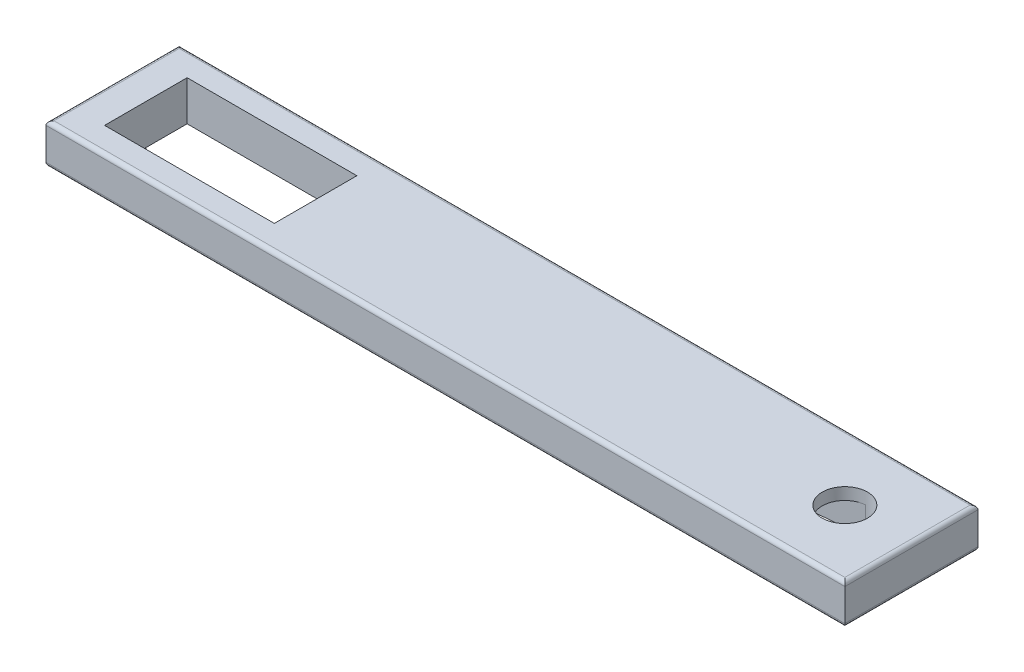
ISO-10303-21;
HEADER;
FILE_DESCRIPTION(('STEP AP214'),'2;1');
FILE_NAME('part.step','',(''),(''),'','','');
FILE_SCHEMA(('AUTOMOTIVE_DESIGN { 1 0 10303 214 1 1 1 1 }'));
ENDSEC;
DATA;
#1=APPLICATION_CONTEXT('core data for automotive mechanical design processes');
#2=APPLICATION_PROTOCOL_DEFINITION('international standard','automotive_design',2000,#1);
#3=PRODUCT_CONTEXT('',#1,'mechanical');
#4=PRODUCT('Part','Part','',(#3));
#5=PRODUCT_RELATED_PRODUCT_CATEGORY('part','',(#4));
#6=PRODUCT_DEFINITION_FORMATION('','',#4);
#7=PRODUCT_DEFINITION_CONTEXT('part definition',#1,'design');
#8=PRODUCT_DEFINITION('design','',#6,#7);
#9=PRODUCT_DEFINITION_SHAPE('','',#8);
#10=(LENGTH_UNIT() NAMED_UNIT(*) SI_UNIT(.MILLI.,.METRE.));
#11=(NAMED_UNIT(*) PLANE_ANGLE_UNIT() SI_UNIT($,.RADIAN.));
#12=(NAMED_UNIT(*) SI_UNIT($,.STERADIAN.) SOLID_ANGLE_UNIT());
#13=UNCERTAINTY_MEASURE_WITH_UNIT(LENGTH_MEASURE(1.E-05),#10,'distance_accuracy_value','');
#14=(GEOMETRIC_REPRESENTATION_CONTEXT(3) GLOBAL_UNCERTAINTY_ASSIGNED_CONTEXT((#13)) GLOBAL_UNIT_ASSIGNED_CONTEXT((#10,
#11,#12)) REPRESENTATION_CONTEXT('',''));
#15=CARTESIAN_POINT('',(0.,0.,0.));
#16=DIRECTION('',(0.,0.,1.));
#17=DIRECTION('',(1.,0.,0.));
#18=AXIS2_PLACEMENT_3D('',#15,#16,#17);
#19=CARTESIAN_POINT('',(0.,4.2,0.));
#20=DIRECTION('',(0.,1.,0.));
#21=DIRECTION('',(0.,0.,1.));
#22=AXIS2_PLACEMENT_3D('',#19,#20,#21);
#23=PLANE('',#22);
#24=CARTESIAN_POINT('',(110.,4.2,-10.));
#25=DIRECTION('',(0.,-1.,0.));
#26=DIRECTION('',(0.,0.,-1.));
#27=AXIS2_PLACEMENT_3D('',#24,#25,#26);
#28=CIRCLE('',#27,3.4);
#29=CARTESIAN_POINT('',(109.694736842105,4.2,-6.61373149256706));
#30=VERTEX_POINT('',#29);
#31=CARTESIAN_POINT('',(109.694736842105,4.2,-13.3862685074329));
#32=VERTEX_POINT('',#31);
#33=EDGE_CURVE('E157',#30,#32,#28,.T.);
#34=ORIENTED_EDGE('',*,*,#33,.F.);
#35=DIRECTION('',(0.995961325715572,0.,0.0897832817337461));
#36=VECTOR('',#35,1.);
#37=CARTESIAN_POINT('',(93.6749226006192,4.2,-8.05787541485463));
#38=LINE('',#37,#36);
#39=CARTESIAN_POINT('',(93.6749226006192,4.2,-8.05787541485463));
#40=VERTEX_POINT('',#39);
#41=EDGE_CURVE('E161',#40,#30,#38,.T.);
#42=ORIENTED_EDGE('',*,*,#41,.F.);
#43=CARTESIAN_POINT('',(93.85,4.2,-10.));
#44=DIRECTION('',(0.,1.,0.));
#45=DIRECTION('',(0.,0.,1.));
#46=AXIS2_PLACEMENT_3D('',#43,#44,#45);
#47=CIRCLE('',#46,1.95);
#48=CARTESIAN_POINT('',(93.6749226006192,4.2,-11.9421245851454));
#49=VERTEX_POINT('',#48);
#50=EDGE_CURVE('E177',#49,#40,#47,.T.);
#51=ORIENTED_EDGE('',*,*,#50,.F.);
#52=DIRECTION('',(-0.995961325715572,0.,0.0897832817337463));
#53=VECTOR('',#52,1.);
#54=CARTESIAN_POINT('',(93.6749226006192,4.2,-11.9421245851454));
#55=LINE('',#54,#53);
#56=EDGE_CURVE('E163',#32,#49,#55,.T.);
#57=ORIENTED_EDGE('',*,*,#56,.F.);
#58=EDGE_LOOP('',(#34,#42,#51,#57));
#59=FACE_BOUND('',#58,.T.);
#60=ADVANCED_FACE('F42',(#59),#23,.F.);
#61=CARTESIAN_POINT('',(93.85,6.,-10.));
#62=DIRECTION('',(0.,-1.,0.));
#63=DIRECTION('',(0.,0.,-1.));
#64=AXIS2_PLACEMENT_3D('',#61,#62,#63);
#65=CYLINDRICAL_SURFACE('',#64,1.95);
#66=DIRECTION('',(0.,-1.,0.));
#67=VECTOR('',#66,1.);
#68=CARTESIAN_POINT('',(93.6749226006192,6.,-11.9421245851454));
#69=LINE('',#68,#67);
#70=CARTESIAN_POINT('',(93.6749226006192,0.,-11.9421245851454));
#71=VERTEX_POINT('',#70);
#72=EDGE_CURVE('E194',#49,#71,#69,.T.);
#73=ORIENTED_EDGE('',*,*,#72,.F.);
#74=ORIENTED_EDGE('',*,*,#50,.T.);
#75=DIRECTION('',(0.,-1.,0.));
#76=VECTOR('',#75,1.);
#77=CARTESIAN_POINT('',(93.6749226006192,6.,-8.05787541485463));
#78=LINE('',#77,#76);
#79=CARTESIAN_POINT('',(93.6749226006192,0.,-8.05787541485463));
#80=VERTEX_POINT('',#79);
#81=EDGE_CURVE('E176',#40,#80,#78,.T.);
#82=ORIENTED_EDGE('',*,*,#81,.T.);
#83=CARTESIAN_POINT('',(93.85,0.,-10.));
#84=DIRECTION('',(0.,1.,0.));
#85=DIRECTION('',(0.,0.,1.));
#86=AXIS2_PLACEMENT_3D('',#83,#84,#85);
#87=CIRCLE('',#86,1.95);
#88=EDGE_CURVE('E638',#71,#80,#87,.T.);
#89=ORIENTED_EDGE('',*,*,#88,.F.);
#90=EDGE_LOOP('',(#73,#74,#82,#89));
#91=FACE_BOUND('',#90,.T.);
#92=ADVANCED_FACE('F389',(#91),#65,.F.);
#93=CARTESIAN_POINT('',(93.6749226006192,6.,-8.05787541485463));
#94=DIRECTION('',(0.0897832817337461,0.,-0.995961325715571));
#95=DIRECTION('',(-0.995961325715572,0.,-0.0897832817337461));
#96=AXIS2_PLACEMENT_3D('',#93,#94,#95);
#97=PLANE('',#96);
#98=ORIENTED_EDGE('',*,*,#81,.F.);
#99=ORIENTED_EDGE('',*,*,#41,.T.);
#100=DIRECTION('',(0.,-1.,0.));
#101=VECTOR('',#100,1.);
#102=CARTESIAN_POINT('',(109.694736842105,6.,-6.61373149256706));
#103=LINE('',#102,#101);
#104=CARTESIAN_POINT('',(109.694736842105,0.,-6.61373149256706));
#105=VERTEX_POINT('',#104);
#106=EDGE_CURVE('E178',#30,#105,#103,.T.);
#107=ORIENTED_EDGE('',*,*,#106,.T.);
#108=DIRECTION('',(0.995961325715572,0.,0.0897832817337461));
#109=VECTOR('',#108,1.);
#110=CARTESIAN_POINT('',(93.6749226006192,0.,-8.05787541485463));
#111=LINE('',#110,#109);
#112=EDGE_CURVE('E643',#80,#105,#111,.T.);
#113=ORIENTED_EDGE('',*,*,#112,.F.);
#114=EDGE_LOOP('',(#98,#99,#107,#113));
#115=FACE_BOUND('',#114,.T.);
#116=ADVANCED_FACE('F173',(#115),#97,.T.);
#117=CARTESIAN_POINT('',(110.,6.,-10.));
#118=DIRECTION('',(0.,-1.,0.));
#119=DIRECTION('',(0.,0.,-1.));
#120=AXIS2_PLACEMENT_3D('',#117,#118,#119);
#121=CYLINDRICAL_SURFACE('',#120,3.4);
#122=ORIENTED_EDGE('',*,*,#106,.F.);
#123=ORIENTED_EDGE('',*,*,#33,.T.);
#124=DIRECTION('',(0.,-1.,0.));
#125=VECTOR('',#124,1.);
#126=CARTESIAN_POINT('',(109.694736842105,6.,-13.3862685074329));
#127=LINE('',#126,#125);
#128=CARTESIAN_POINT('',(109.694736842105,0.,-13.3862685074329));
#129=VERTEX_POINT('',#128);
#130=EDGE_CURVE('E190',#32,#129,#127,.T.);
#131=ORIENTED_EDGE('',*,*,#130,.T.);
#132=CARTESIAN_POINT('',(110.,0.,-10.));
#133=DIRECTION('',(0.,1.,0.));
#134=DIRECTION('',(0.,0.,1.));
#135=AXIS2_PLACEMENT_3D('',#132,#133,#134);
#136=CIRCLE('',#135,3.4);
#137=EDGE_CURVE('E183',#105,#129,#136,.T.);
#138=ORIENTED_EDGE('',*,*,#137,.F.);
#139=EDGE_LOOP('',(#122,#123,#131,#138));
#140=FACE_BOUND('',#139,.T.);
#141=CARTESIAN_POINT('',(110.,6.,-10.));
#142=DIRECTION('',(0.,-1.,0.));
#143=DIRECTION('',(0.,0.,-1.));
#144=AXIS2_PLACEMENT_3D('',#141,#142,#143);
#145=CIRCLE('',#144,3.4);
#146=CARTESIAN_POINT('',(110.,6.,-13.4));
#147=VERTEX_POINT('',#146);
#148=EDGE_CURVE('E166',#147,#147,#145,.T.);
#149=ORIENTED_EDGE('',*,*,#148,.F.);
#150=EDGE_LOOP('',(#149));
#151=FACE_BOUND('',#150,.T.);
#152=ADVANCED_FACE('F185',(#140,#151),#121,.F.);
#153=CARTESIAN_POINT('',(93.6749226006192,6.,-11.9421245851454));
#154=DIRECTION('',(0.0897832817337463,0.,0.995961325715571));
#155=DIRECTION('',(0.995961325715572,0.,-0.0897832817337463));
#156=AXIS2_PLACEMENT_3D('',#153,#154,#155);
#157=PLANE('',#156);
#158=ORIENTED_EDGE('',*,*,#130,.F.);
#159=ORIENTED_EDGE('',*,*,#56,.T.);
#160=ORIENTED_EDGE('',*,*,#72,.T.);
#161=DIRECTION('',(-0.995961325715572,0.,0.0897832817337463));
#162=VECTOR('',#161,1.);
#163=CARTESIAN_POINT('',(93.6749226006192,0.,-11.9421245851454));
#164=LINE('',#163,#162);
#165=EDGE_CURVE('E634',#129,#71,#164,.T.);
#166=ORIENTED_EDGE('',*,*,#165,.F.);
#167=EDGE_LOOP('',(#158,#159,#160,#166));
#168=FACE_BOUND('',#167,.T.);
#169=ADVANCED_FACE('F414',(#168),#157,.T.);
#170=CARTESIAN_POINT('',(0.,6.,0.));
#171=DIRECTION('',(0.,-1.,0.));
#172=DIRECTION('',(0.,0.,-1.));
#173=AXIS2_PLACEMENT_3D('',#170,#171,#172);
#174=PLANE('',#173);
#175=DIRECTION('',(0.,0.,1.));
#176=VECTOR('',#175,1.);
#177=CARTESIAN_POINT('',(0.6,6.,0.));
#178=LINE('',#177,#176);
#179=CARTESIAN_POINT('',(0.6,6.,-19.4));
#180=VERTEX_POINT('',#179);
#181=CARTESIAN_POINT('',(0.6,6.,-0.6));
#182=VERTEX_POINT('',#181);
#183=EDGE_CURVE('E266',#180,#182,#178,.T.);
#184=ORIENTED_EDGE('',*,*,#183,.T.);
#185=DIRECTION('',(1.,0.,0.));
#186=VECTOR('',#185,1.);
#187=CARTESIAN_POINT('',(0.,6.,-0.6));
#188=LINE('',#187,#186);
#189=CARTESIAN_POINT('',(119.4,6.,-0.6));
#190=VERTEX_POINT('',#189);
#191=EDGE_CURVE('E269',#182,#190,#188,.T.);
#192=ORIENTED_EDGE('',*,*,#191,.T.);
#193=DIRECTION('',(0.,0.,-1.));
#194=VECTOR('',#193,1.);
#195=CARTESIAN_POINT('',(119.4,6.,0.));
#196=LINE('',#195,#194);
#197=CARTESIAN_POINT('',(119.4,6.,-19.4));
#198=VERTEX_POINT('',#197);
#199=EDGE_CURVE('E263',#190,#198,#196,.T.);
#200=ORIENTED_EDGE('',*,*,#199,.T.);
#201=DIRECTION('',(-1.,0.,0.));
#202=VECTOR('',#201,1.);
#203=CARTESIAN_POINT('',(0.,6.,-19.4));
#204=LINE('',#203,#202);
#205=EDGE_CURVE('E259',#198,#180,#204,.T.);
#206=ORIENTED_EDGE('',*,*,#205,.T.);
#207=EDGE_LOOP('',(#184,#192,#200,#206));
#208=FACE_BOUND('',#207,.T.);
#209=ORIENTED_EDGE('',*,*,#148,.T.);
#210=EDGE_LOOP('',(#209));
#211=FACE_BOUND('',#210,.T.);
#212=DIRECTION('',(0.,0.,1.));
#213=VECTOR('',#212,1.);
#214=CARTESIAN_POINT('',(5.,6.,-16.2));
#215=LINE('',#214,#213);
#216=CARTESIAN_POINT('',(5.,6.,-16.2));
#217=VERTEX_POINT('',#216);
#218=CARTESIAN_POINT('',(5.,6.,-3.8));
#219=VERTEX_POINT('',#218);
#220=EDGE_CURVE('E196',#217,#219,#215,.T.);
#221=ORIENTED_EDGE('',*,*,#220,.F.);
#222=DIRECTION('',(-1.,0.,0.));
#223=VECTOR('',#222,1.);
#224=CARTESIAN_POINT('',(5.,6.,-16.2));
#225=LINE('',#224,#223);
#226=CARTESIAN_POINT('',(30.5,6.,-16.2));
#227=VERTEX_POINT('',#226);
#228=EDGE_CURVE('E207',#227,#217,#225,.T.);
#229=ORIENTED_EDGE('',*,*,#228,.F.);
#230=DIRECTION('',(0.,0.,-1.));
#231=VECTOR('',#230,1.);
#232=CARTESIAN_POINT('',(30.5,6.,-16.2));
#233=LINE('',#232,#231);
#234=CARTESIAN_POINT('',(30.5,6.,-3.8));
#235=VERTEX_POINT('',#234);
#236=EDGE_CURVE('E202',#235,#227,#233,.T.);
#237=ORIENTED_EDGE('',*,*,#236,.F.);
#238=DIRECTION('',(1.,0.,0.));
#239=VECTOR('',#238,1.);
#240=CARTESIAN_POINT('',(5.,6.,-3.8));
#241=LINE('',#240,#239);
#242=EDGE_CURVE('E203',#219,#235,#241,.T.);
#243=ORIENTED_EDGE('',*,*,#242,.F.);
#244=EDGE_LOOP('',(#221,#229,#237,#243));
#245=FACE_BOUND('',#244,.T.);
#246=ADVANCED_FACE('F373',(#208,#211,#245),#174,.F.);
#247=CARTESIAN_POINT('',(0.,0.,0.));
#248=DIRECTION('',(0.,-1.,0.));
#249=DIRECTION('',(0.,0.,-1.));
#250=AXIS2_PLACEMENT_3D('',#247,#248,#249);
#251=PLANE('',#250);
#252=DIRECTION('',(0.,0.,-1.));
#253=VECTOR('',#252,1.);
#254=CARTESIAN_POINT('',(119.4,0.,0.));
#255=LINE('',#254,#253);
#256=CARTESIAN_POINT('',(119.4,0.,-19.4));
#257=VERTEX_POINT('',#256);
#258=CARTESIAN_POINT('',(119.4,0.,-0.6));
#259=VERTEX_POINT('',#258);
#260=EDGE_CURVE('E53',#257,#259,#255,.F.);
#261=ORIENTED_EDGE('',*,*,#260,.T.);
#262=DIRECTION('',(1.,0.,0.));
#263=VECTOR('',#262,1.);
#264=CARTESIAN_POINT('',(0.,0.,-0.6));
#265=LINE('',#264,#263);
#266=CARTESIAN_POINT('',(0.6,0.,-0.6));
#267=VERTEX_POINT('',#266);
#268=EDGE_CURVE('E11',#259,#267,#265,.F.);
#269=ORIENTED_EDGE('',*,*,#268,.T.);
#270=DIRECTION('',(0.,0.,1.));
#271=VECTOR('',#270,1.);
#272=CARTESIAN_POINT('',(0.6,0.,-20.));
#273=LINE('',#272,#271);
#274=CARTESIAN_POINT('',(0.6,0.,-19.4));
#275=VERTEX_POINT('',#274);
#276=EDGE_CURVE('E305',#267,#275,#273,.F.);
#277=ORIENTED_EDGE('',*,*,#276,.T.);
#278=DIRECTION('',(-1.,0.,0.));
#279=VECTOR('',#278,1.);
#280=CARTESIAN_POINT('',(120.,0.,-19.4));
#281=LINE('',#280,#279);
#282=EDGE_CURVE('E298',#275,#257,#281,.F.);
#283=ORIENTED_EDGE('',*,*,#282,.T.);
#284=EDGE_LOOP('',(#261,#269,#277,#283));
#285=FACE_BOUND('',#284,.T.);
#286=CARTESIAN_POINT('',(4.25,0.,-10.));
#287=DIRECTION('',(0.,-1.,0.));
#288=DIRECTION('',(0.,0.,-1.));
#289=AXIS2_PLACEMENT_3D('',#286,#287,#288);
#290=CIRCLE('',#289,0.550000000000003);
#291=CARTESIAN_POINT('',(4.25,0.,-10.55));
#292=VERTEX_POINT('',#291);
#293=EDGE_CURVE('E257',#292,#292,#290,.T.);
#294=ORIENTED_EDGE('',*,*,#293,.F.);
#295=EDGE_LOOP('',(#294));
#296=FACE_BOUND('',#295,.T.);
#297=CARTESIAN_POINT('',(31.25,0.,-10.));
#298=DIRECTION('',(0.,-1.,0.));
#299=DIRECTION('',(0.,0.,-1.));
#300=AXIS2_PLACEMENT_3D('',#297,#298,#299);
#301=CIRCLE('',#300,0.550000000000003);
#302=CARTESIAN_POINT('',(31.25,0.,-10.55));
#303=VERTEX_POINT('',#302);
#304=EDGE_CURVE('E258',#303,#303,#301,.T.);
#305=ORIENTED_EDGE('',*,*,#304,.F.);
#306=EDGE_LOOP('',(#305));
#307=FACE_BOUND('',#306,.T.);
#308=DIRECTION('',(-1.,0.,0.));
#309=VECTOR('',#308,1.);
#310=CARTESIAN_POINT('',(5.,0.,-16.2));
#311=LINE('',#310,#309);
#312=CARTESIAN_POINT('',(30.5,0.,-16.2));
#313=VERTEX_POINT('',#312);
#314=CARTESIAN_POINT('',(5.,0.,-16.2));
#315=VERTEX_POINT('',#314);
#316=EDGE_CURVE('E205',#313,#315,#311,.T.);
#317=ORIENTED_EDGE('',*,*,#316,.T.);
#318=DIRECTION('',(0.,0.,1.));
#319=VECTOR('',#318,1.);
#320=CARTESIAN_POINT('',(5.,0.,-16.2));
#321=LINE('',#320,#319);
#322=CARTESIAN_POINT('',(5.,0.,-3.8));
#323=VERTEX_POINT('',#322);
#324=EDGE_CURVE('E195',#315,#323,#321,.T.);
#325=ORIENTED_EDGE('',*,*,#324,.T.);
#326=DIRECTION('',(1.,0.,0.));
#327=VECTOR('',#326,1.);
#328=CARTESIAN_POINT('',(5.,0.,-3.8));
#329=LINE('',#328,#327);
#330=CARTESIAN_POINT('',(30.5,0.,-3.8));
#331=VERTEX_POINT('',#330);
#332=EDGE_CURVE('E216',#323,#331,#329,.T.);
#333=ORIENTED_EDGE('',*,*,#332,.T.);
#334=DIRECTION('',(0.,0.,-1.));
#335=VECTOR('',#334,1.);
#336=CARTESIAN_POINT('',(30.5,0.,-16.2));
#337=LINE('',#336,#335);
#338=EDGE_CURVE('E219',#331,#313,#337,.T.);
#339=ORIENTED_EDGE('',*,*,#338,.T.);
#340=EDGE_LOOP('',(#317,#325,#333,#339));
#341=FACE_BOUND('',#340,.T.);
#342=ORIENTED_EDGE('',*,*,#165,.T.);
#343=ORIENTED_EDGE('',*,*,#88,.T.);
#344=ORIENTED_EDGE('',*,*,#112,.T.);
#345=ORIENTED_EDGE('',*,*,#137,.T.);
#346=EDGE_LOOP('',(#342,#343,#344,#345));
#347=FACE_BOUND('',#346,.T.);
#348=ADVANCED_FACE('F338',(#285,#296,#307,#341,#347),#251,.T.);
#349=CARTESIAN_POINT('',(0.,6.,0.));
#350=DIRECTION('',(1.,0.,0.));
#351=DIRECTION('',(0.,0.,-1.));
#352=AXIS2_PLACEMENT_3D('',#349,#350,#351);
#353=PLANE('',#352);
#354=DIRECTION('',(0.,-1.,0.));
#355=VECTOR('',#354,1.);
#356=CARTESIAN_POINT('',(0.,6.,0.));
#357=LINE('',#356,#355);
#358=CARTESIAN_POINT('',(0.,5.4,0.));
#359=VERTEX_POINT('',#358);
#360=CARTESIAN_POINT('',(0.,0.6,0.));
#361=VERTEX_POINT('',#360);
#362=EDGE_CURVE('E252',#359,#361,#357,.T.);
#363=ORIENTED_EDGE('',*,*,#362,.F.);
#364=DIRECTION('',(0.,0.,1.));
#365=VECTOR('',#364,1.);
#366=CARTESIAN_POINT('',(0.,5.4,0.));
#367=LINE('',#366,#365);
#368=CARTESIAN_POINT('',(0.,5.4,-20.));
#369=VERTEX_POINT('',#368);
#370=EDGE_CURVE('E277',#359,#369,#367,.F.);
#371=ORIENTED_EDGE('',*,*,#370,.T.);
#372=DIRECTION('',(0.,-1.,0.));
#373=VECTOR('',#372,1.);
#374=CARTESIAN_POINT('',(0.,6.,-20.));
#375=LINE('',#374,#373);
#376=CARTESIAN_POINT('',(0.,0.6,-20.));
#377=VERTEX_POINT('',#376);
#378=EDGE_CURVE('E238',#369,#377,#375,.T.);
#379=ORIENTED_EDGE('',*,*,#378,.T.);
#380=DIRECTION('',(0.,0.,1.));
#381=VECTOR('',#380,1.);
#382=CARTESIAN_POINT('',(0.,0.6,0.));
#383=LINE('',#382,#381);
#384=EDGE_CURVE('E272',#377,#361,#383,.T.);
#385=ORIENTED_EDGE('',*,*,#384,.T.);
#386=EDGE_LOOP('',(#363,#371,#379,#385));
#387=FACE_BOUND('',#386,.T.);
#388=ADVANCED_FACE('F362',(#387),#353,.F.);
#389=CARTESIAN_POINT('',(0.,6.,0.));
#390=DIRECTION('',(0.,0.,-1.));
#391=DIRECTION('',(-1.,0.,0.));
#392=AXIS2_PLACEMENT_3D('',#389,#390,#391);
#393=PLANE('',#392);
#394=DIRECTION('',(0.,-1.,0.));
#395=VECTOR('',#394,1.);
#396=CARTESIAN_POINT('',(120.,6.,0.));
#397=LINE('',#396,#395);
#398=CARTESIAN_POINT('',(120.,5.4,0.));
#399=VERTEX_POINT('',#398);
#400=CARTESIAN_POINT('',(120.,0.6,0.));
#401=VERTEX_POINT('',#400);
#402=EDGE_CURVE('E246',#399,#401,#397,.T.);
#403=ORIENTED_EDGE('',*,*,#402,.F.);
#404=DIRECTION('',(1.,0.,0.));
#405=VECTOR('',#404,1.);
#406=CARTESIAN_POINT('',(0.,5.4,0.));
#407=LINE('',#406,#405);
#408=EDGE_CURVE('E287',#399,#359,#407,.F.);
#409=ORIENTED_EDGE('',*,*,#408,.T.);
#410=ORIENTED_EDGE('',*,*,#362,.T.);
#411=DIRECTION('',(1.,0.,0.));
#412=VECTOR('',#411,1.);
#413=CARTESIAN_POINT('',(120.,0.6,0.));
#414=LINE('',#413,#412);
#415=EDGE_CURVE('E290',#361,#401,#414,.T.);
#416=ORIENTED_EDGE('',*,*,#415,.T.);
#417=EDGE_LOOP('',(#403,#409,#410,#416));
#418=FACE_BOUND('',#417,.T.);
#419=ADVANCED_FACE('F378',(#418),#393,.F.);
#420=CARTESIAN_POINT('',(120.,6.,0.));
#421=DIRECTION('',(-1.,0.,0.));
#422=DIRECTION('',(0.,0.,1.));
#423=AXIS2_PLACEMENT_3D('',#420,#421,#422);
#424=PLANE('',#423);
#425=DIRECTION('',(0.,-1.,0.));
#426=VECTOR('',#425,1.);
#427=CARTESIAN_POINT('',(120.,6.,-20.));
#428=LINE('',#427,#426);
#429=CARTESIAN_POINT('',(120.,5.4,-20.));
#430=VERTEX_POINT('',#429);
#431=CARTESIAN_POINT('',(120.,0.6,-20.));
#432=VERTEX_POINT('',#431);
#433=EDGE_CURVE('E243',#430,#432,#428,.T.);
#434=ORIENTED_EDGE('',*,*,#433,.F.);
#435=DIRECTION('',(0.,0.,-1.));
#436=VECTOR('',#435,1.);
#437=CARTESIAN_POINT('',(120.,5.4,0.));
#438=LINE('',#437,#436);
#439=EDGE_CURVE('E283',#430,#399,#438,.F.);
#440=ORIENTED_EDGE('',*,*,#439,.T.);
#441=ORIENTED_EDGE('',*,*,#402,.T.);
#442=DIRECTION('',(0.,0.,-1.));
#443=VECTOR('',#442,1.);
#444=CARTESIAN_POINT('',(120.,0.6,-20.));
#445=LINE('',#444,#443);
#446=EDGE_CURVE('E278',#401,#432,#445,.T.);
#447=ORIENTED_EDGE('',*,*,#446,.T.);
#448=EDGE_LOOP('',(#434,#440,#441,#447));
#449=FACE_BOUND('',#448,.T.);
#450=ADVANCED_FACE('F346',(#449),#424,.F.);
#451=CARTESIAN_POINT('',(0.,6.,-20.));
#452=DIRECTION('',(0.,0.,1.));
#453=DIRECTION('',(1.,0.,0.));
#454=AXIS2_PLACEMENT_3D('',#451,#452,#453);
#455=PLANE('',#454);
#456=ORIENTED_EDGE('',*,*,#378,.F.);
#457=DIRECTION('',(-1.,0.,0.));
#458=VECTOR('',#457,1.);
#459=CARTESIAN_POINT('',(0.,5.4,-20.));
#460=LINE('',#459,#458);
#461=EDGE_CURVE('E299',#369,#430,#460,.F.);
#462=ORIENTED_EDGE('',*,*,#461,.T.);
#463=ORIENTED_EDGE('',*,*,#433,.T.);
#464=DIRECTION('',(-1.,0.,0.));
#465=VECTOR('',#464,1.);
#466=CARTESIAN_POINT('',(0.,0.6,-20.));
#467=LINE('',#466,#465);
#468=EDGE_CURVE('E291',#432,#377,#467,.T.);
#469=ORIENTED_EDGE('',*,*,#468,.T.);
#470=EDGE_LOOP('',(#456,#462,#463,#469));
#471=FACE_BOUND('',#470,.T.);
#472=ADVANCED_FACE('F354',(#471),#455,.F.);
#473=CARTESIAN_POINT('',(5.,6.,-16.2));
#474=DIRECTION('',(1.,0.,0.));
#475=DIRECTION('',(0.,0.,-1.));
#476=AXIS2_PLACEMENT_3D('',#473,#474,#475);
#477=PLANE('',#476);
#478=ORIENTED_EDGE('',*,*,#324,.F.);
#479=DIRECTION('',(0.,-1.,0.));
#480=VECTOR('',#479,1.);
#481=CARTESIAN_POINT('',(5.,6.,-16.2));
#482=LINE('',#481,#480);
#483=EDGE_CURVE('E215',#217,#315,#482,.T.);
#484=ORIENTED_EDGE('',*,*,#483,.F.);
#485=ORIENTED_EDGE('',*,*,#220,.T.);
#486=DIRECTION('',(0.,-1.,0.));
#487=VECTOR('',#486,1.);
#488=CARTESIAN_POINT('',(5.,6.,-3.8));
#489=LINE('',#488,#487);
#490=EDGE_CURVE('E237',#219,#323,#489,.T.);
#491=ORIENTED_EDGE('',*,*,#490,.T.);
#492=EDGE_LOOP('',(#478,#484,#485,#491));
#493=FACE_BOUND('',#492,.T.);
#494=ADVANCED_FACE('F431',(#493),#477,.T.);
#495=CARTESIAN_POINT('',(5.,6.,-3.8));
#496=DIRECTION('',(0.,0.,-1.));
#497=DIRECTION('',(-1.,0.,0.));
#498=AXIS2_PLACEMENT_3D('',#495,#496,#497);
#499=PLANE('',#498);
#500=ORIENTED_EDGE('',*,*,#332,.F.);
#501=ORIENTED_EDGE('',*,*,#490,.F.);
#502=ORIENTED_EDGE('',*,*,#242,.T.);
#503=DIRECTION('',(0.,-1.,0.));
#504=VECTOR('',#503,1.);
#505=CARTESIAN_POINT('',(30.5,6.,-3.8));
#506=LINE('',#505,#504);
#507=EDGE_CURVE('E231',#235,#331,#506,.T.);
#508=ORIENTED_EDGE('',*,*,#507,.T.);
#509=EDGE_LOOP('',(#500,#501,#502,#508));
#510=FACE_BOUND('',#509,.T.);
#511=ADVANCED_FACE('F430',(#510),#499,.T.);
#512=CARTESIAN_POINT('',(30.5,6.,-16.2));
#513=DIRECTION('',(-1.,0.,0.));
#514=DIRECTION('',(0.,0.,1.));
#515=AXIS2_PLACEMENT_3D('',#512,#513,#514);
#516=PLANE('',#515);
#517=ORIENTED_EDGE('',*,*,#338,.F.);
#518=ORIENTED_EDGE('',*,*,#507,.F.);
#519=ORIENTED_EDGE('',*,*,#236,.T.);
#520=DIRECTION('',(0.,-1.,0.));
#521=VECTOR('',#520,1.);
#522=CARTESIAN_POINT('',(30.5,6.,-16.2));
#523=LINE('',#522,#521);
#524=EDGE_CURVE('E227',#227,#313,#523,.T.);
#525=ORIENTED_EDGE('',*,*,#524,.T.);
#526=EDGE_LOOP('',(#517,#518,#519,#525));
#527=FACE_BOUND('',#526,.T.);
#528=ADVANCED_FACE('F421',(#527),#516,.T.);
#529=CARTESIAN_POINT('',(5.,6.,-16.2));
#530=DIRECTION('',(0.,0.,1.));
#531=DIRECTION('',(1.,0.,0.));
#532=AXIS2_PLACEMENT_3D('',#529,#530,#531);
#533=PLANE('',#532);
#534=ORIENTED_EDGE('',*,*,#316,.F.);
#535=ORIENTED_EDGE('',*,*,#524,.F.);
#536=ORIENTED_EDGE('',*,*,#228,.T.);
#537=ORIENTED_EDGE('',*,*,#483,.T.);
#538=EDGE_LOOP('',(#534,#535,#536,#537));
#539=FACE_BOUND('',#538,.T.);
#540=ADVANCED_FACE('F408',(#539),#533,.T.);
#541=CARTESIAN_POINT('',(31.25,-3.,-10.));
#542=DIRECTION('',(0.,1.,0.));
#543=DIRECTION('',(0.,0.,1.));
#544=AXIS2_PLACEMENT_3D('',#541,#542,#543);
#545=CYLINDRICAL_SURFACE('',#544,0.550000000000003);
#546=CARTESIAN_POINT('',(31.25,-3.,-10.));
#547=DIRECTION('',(0.,-1.,0.));
#548=DIRECTION('',(0.,0.,-1.));
#549=AXIS2_PLACEMENT_3D('',#546,#547,#548);
#550=CIRCLE('',#549,0.550000000000003);
#551=CARTESIAN_POINT('',(31.25,-3.,-10.55));
#552=VERTEX_POINT('',#551);
#553=EDGE_CURVE('E647',#552,#552,#550,.T.);
#554=ORIENTED_EDGE('',*,*,#553,.F.);
#555=EDGE_LOOP('',(#554));
#556=FACE_BOUND('',#555,.T.);
#557=ORIENTED_EDGE('',*,*,#304,.T.);
#558=EDGE_LOOP('',(#557));
#559=FACE_BOUND('',#558,.T.);
#560=ADVANCED_FACE('F409',(#556,#559),#545,.T.);
#561=CARTESIAN_POINT('',(31.25,-3.,-10.));
#562=DIRECTION('',(0.,-1.,0.));
#563=DIRECTION('',(0.,0.,-1.));
#564=AXIS2_PLACEMENT_3D('',#561,#562,#563);
#565=PLANE('',#564);
#566=ORIENTED_EDGE('',*,*,#553,.T.);
#567=EDGE_LOOP('',(#566));
#568=FACE_BOUND('',#567,.T.);
#569=ADVANCED_FACE('F404',(#568),#565,.T.);
#570=CARTESIAN_POINT('',(4.25,-3.,-10.));
#571=DIRECTION('',(0.,1.,0.));
#572=DIRECTION('',(0.,0.,1.));
#573=AXIS2_PLACEMENT_3D('',#570,#571,#572);
#574=CYLINDRICAL_SURFACE('',#573,0.550000000000003);
#575=CARTESIAN_POINT('',(4.25,-3.,-10.));
#576=DIRECTION('',(0.,-1.,0.));
#577=DIRECTION('',(0.,0.,-1.));
#578=AXIS2_PLACEMENT_3D('',#575,#576,#577);
#579=CIRCLE('',#578,0.550000000000003);
#580=CARTESIAN_POINT('',(4.25,-3.,-10.55));
#581=VERTEX_POINT('',#580);
#582=EDGE_CURVE('E648',#581,#581,#579,.T.);
#583=ORIENTED_EDGE('',*,*,#582,.F.);
#584=EDGE_LOOP('',(#583));
#585=FACE_BOUND('',#584,.T.);
#586=ORIENTED_EDGE('',*,*,#293,.T.);
#587=EDGE_LOOP('',(#586));
#588=FACE_BOUND('',#587,.T.);
#589=ADVANCED_FACE('F397',(#585,#588),#574,.T.);
#590=CARTESIAN_POINT('',(4.25,-3.,-10.));
#591=DIRECTION('',(0.,-1.,0.));
#592=DIRECTION('',(0.,0.,-1.));
#593=AXIS2_PLACEMENT_3D('',#590,#591,#592);
#594=PLANE('',#593);
#595=ORIENTED_EDGE('',*,*,#582,.T.);
#596=EDGE_LOOP('',(#595));
#597=FACE_BOUND('',#596,.T.);
#598=ADVANCED_FACE('F400',(#597),#594,.T.);
#599=CARTESIAN_POINT('',(119.4,5.4,0.));
#600=DIRECTION('',(0.,0.,-1.));
#601=DIRECTION('',(-1.,0.,0.));
#602=AXIS2_PLACEMENT_3D('',#599,#600,#601);
#603=CYLINDRICAL_SURFACE('',#602,0.6);
#604=CARTESIAN_POINT('',(119.4,5.4,-0.6));
#605=DIRECTION('',(0.707106781186547,0.,-0.707106781186547));
#606=DIRECTION('',(0.707106781186547,0.,0.707106781186547));
#607=AXIS2_PLACEMENT_3D('',#604,#605,#606);
#608=ELLIPSE('',#607,0.848528137423857,0.6);
#609=EDGE_CURVE('E311',#399,#190,#608,.F.);
#610=ORIENTED_EDGE('',*,*,#609,.F.);
#611=ORIENTED_EDGE('',*,*,#439,.F.);
#612=CARTESIAN_POINT('',(119.4,5.4,-19.4));
#613=DIRECTION('',(-0.707106781186547,0.,-0.707106781186547));
#614=DIRECTION('',(-0.707106781186547,0.,0.707106781186547));
#615=AXIS2_PLACEMENT_3D('',#612,#613,#614);
#616=ELLIPSE('',#615,0.848528137423857,0.6);
#617=EDGE_CURVE('E168',#198,#430,#616,.T.);
#618=ORIENTED_EDGE('',*,*,#617,.F.);
#619=ORIENTED_EDGE('',*,*,#199,.F.);
#620=EDGE_LOOP('',(#610,#611,#618,#619));
#621=FACE_BOUND('',#620,.T.);
#622=ADVANCED_FACE('F376',(#621),#603,.T.);
#623=CARTESIAN_POINT('',(0.,5.4,-19.4));
#624=DIRECTION('',(-1.,0.,0.));
#625=DIRECTION('',(0.,0.,1.));
#626=AXIS2_PLACEMENT_3D('',#623,#624,#625);
#627=CYLINDRICAL_SURFACE('',#626,0.6);
#628=ORIENTED_EDGE('',*,*,#617,.T.);
#629=ORIENTED_EDGE('',*,*,#461,.F.);
#630=CARTESIAN_POINT('',(0.6,5.4,-19.4));
#631=DIRECTION('',(-0.707106781186547,0.,0.707106781186547));
#632=DIRECTION('',(-0.707106781186547,0.,-0.707106781186547));
#633=AXIS2_PLACEMENT_3D('',#630,#631,#632);
#634=ELLIPSE('',#633,0.848528137423857,0.6);
#635=EDGE_CURVE('E309',#180,#369,#634,.T.);
#636=ORIENTED_EDGE('',*,*,#635,.F.);
#637=ORIENTED_EDGE('',*,*,#205,.F.);
#638=EDGE_LOOP('',(#628,#629,#636,#637));
#639=FACE_BOUND('',#638,.T.);
#640=ADVANCED_FACE('F352',(#639),#627,.T.);
#641=CARTESIAN_POINT('',(0.,5.4,-0.6));
#642=DIRECTION('',(1.,0.,0.));
#643=DIRECTION('',(0.,0.,-1.));
#644=AXIS2_PLACEMENT_3D('',#641,#642,#643);
#645=CYLINDRICAL_SURFACE('',#644,0.6);
#646=ORIENTED_EDGE('',*,*,#609,.T.);
#647=ORIENTED_EDGE('',*,*,#191,.F.);
#648=CARTESIAN_POINT('',(0.6,5.4,-0.6));
#649=DIRECTION('',(0.707106781186547,0.,0.707106781186547));
#650=DIRECTION('',(0.707106781186547,0.,-0.707106781186547));
#651=AXIS2_PLACEMENT_3D('',#648,#649,#650);
#652=ELLIPSE('',#651,0.848528137423857,0.6);
#653=EDGE_CURVE('E307',#359,#182,#652,.F.);
#654=ORIENTED_EDGE('',*,*,#653,.F.);
#655=ORIENTED_EDGE('',*,*,#408,.F.);
#656=EDGE_LOOP('',(#646,#647,#654,#655));
#657=FACE_BOUND('',#656,.T.);
#658=ADVANCED_FACE('F369',(#657),#645,.T.);
#659=CARTESIAN_POINT('',(0.6,5.4,0.));
#660=DIRECTION('',(0.,0.,1.));
#661=DIRECTION('',(1.,0.,0.));
#662=AXIS2_PLACEMENT_3D('',#659,#660,#661);
#663=CYLINDRICAL_SURFACE('',#662,0.6);
#664=ORIENTED_EDGE('',*,*,#635,.T.);
#665=ORIENTED_EDGE('',*,*,#370,.F.);
#666=ORIENTED_EDGE('',*,*,#653,.T.);
#667=ORIENTED_EDGE('',*,*,#183,.F.);
#668=EDGE_LOOP('',(#664,#665,#666,#667));
#669=FACE_BOUND('',#668,.T.);
#670=ADVANCED_FACE('F364',(#669),#663,.T.);
#671=CARTESIAN_POINT('',(0.6,0.6,0.));
#672=DIRECTION('',(0.,0.,-1.));
#673=DIRECTION('',(-1.,0.,0.));
#674=AXIS2_PLACEMENT_3D('',#671,#672,#673);
#675=CYLINDRICAL_SURFACE('',#674,0.6);
#676=CARTESIAN_POINT('',(0.6,0.6,-19.4));
#677=DIRECTION('',(0.707106781186547,0.,-0.707106781186547));
#678=DIRECTION('',(0.707106781186547,0.,0.707106781186547));
#679=AXIS2_PLACEMENT_3D('',#676,#677,#678);
#680=ELLIPSE('',#679,0.848528137423857,0.6);
#681=EDGE_CURVE('E322',#275,#377,#680,.T.);
#682=ORIENTED_EDGE('',*,*,#681,.F.);
#683=ORIENTED_EDGE('',*,*,#276,.F.);
#684=CARTESIAN_POINT('',(0.6,0.6,-0.6));
#685=DIRECTION('',(-0.707106781186547,0.,-0.707106781186547));
#686=DIRECTION('',(-0.707106781186547,0.,0.707106781186547));
#687=AXIS2_PLACEMENT_3D('',#684,#685,#686);
#688=ELLIPSE('',#687,0.848528137423857,0.6);
#689=EDGE_CURVE('E48',#361,#267,#688,.F.);
#690=ORIENTED_EDGE('',*,*,#689,.F.);
#691=ORIENTED_EDGE('',*,*,#384,.F.);
#692=EDGE_LOOP('',(#682,#683,#690,#691));
#693=FACE_BOUND('',#692,.T.);
#694=ADVANCED_FACE('F46',(#693),#675,.T.);
#695=CARTESIAN_POINT('',(0.,0.6,-0.6));
#696=DIRECTION('',(-1.,0.,0.));
#697=DIRECTION('',(0.,0.,1.));
#698=AXIS2_PLACEMENT_3D('',#695,#696,#697);
#699=CYLINDRICAL_SURFACE('',#698,0.6);
#700=ORIENTED_EDGE('',*,*,#689,.T.);
#701=ORIENTED_EDGE('',*,*,#268,.F.);
#702=CARTESIAN_POINT('',(119.4,0.6,-0.6));
#703=DIRECTION('',(-0.707106781186547,0.,0.707106781186547));
#704=DIRECTION('',(-0.707106781186547,0.,-0.707106781186547));
#705=AXIS2_PLACEMENT_3D('',#702,#703,#704);
#706=ELLIPSE('',#705,0.848528137423857,0.6);
#707=EDGE_CURVE('E61',#401,#259,#706,.F.);
#708=ORIENTED_EDGE('',*,*,#707,.F.);
#709=ORIENTED_EDGE('',*,*,#415,.F.);
#710=EDGE_LOOP('',(#700,#701,#708,#709));
#711=FACE_BOUND('',#710,.T.);
#712=ADVANCED_FACE('F339',(#711),#699,.T.);
#713=CARTESIAN_POINT('',(0.,0.6,-19.4));
#714=DIRECTION('',(1.,0.,0.));
#715=DIRECTION('',(0.,0.,-1.));
#716=AXIS2_PLACEMENT_3D('',#713,#714,#715);
#717=CYLINDRICAL_SURFACE('',#716,0.6);
#718=ORIENTED_EDGE('',*,*,#681,.T.);
#719=ORIENTED_EDGE('',*,*,#468,.F.);
#720=CARTESIAN_POINT('',(119.4,0.6,-19.4));
#721=DIRECTION('',(0.707106781186547,0.,0.707106781186547));
#722=DIRECTION('',(0.707106781186547,0.,-0.707106781186547));
#723=AXIS2_PLACEMENT_3D('',#720,#721,#722);
#724=ELLIPSE('',#723,0.848528137423857,0.6);
#725=EDGE_CURVE('E319',#257,#432,#724,.T.);
#726=ORIENTED_EDGE('',*,*,#725,.F.);
#727=ORIENTED_EDGE('',*,*,#282,.F.);
#728=EDGE_LOOP('',(#718,#719,#726,#727));
#729=FACE_BOUND('',#728,.T.);
#730=ADVANCED_FACE('F341',(#729),#717,.T.);
#731=CARTESIAN_POINT('',(119.4,0.6,0.));
#732=DIRECTION('',(0.,0.,1.));
#733=DIRECTION('',(1.,0.,0.));
#734=AXIS2_PLACEMENT_3D('',#731,#732,#733);
#735=CYLINDRICAL_SURFACE('',#734,0.6);
#736=ORIENTED_EDGE('',*,*,#707,.T.);
#737=ORIENTED_EDGE('',*,*,#260,.F.);
#738=ORIENTED_EDGE('',*,*,#725,.T.);
#739=ORIENTED_EDGE('',*,*,#446,.F.);
#740=EDGE_LOOP('',(#736,#737,#738,#739));
#741=FACE_BOUND('',#740,.T.);
#742=ADVANCED_FACE('F345',(#741),#735,.T.);
#743=CLOSED_SHELL('',(#60,#92,#116,#152,#169,#246,#348,#388,#419,#450,#472,#494,#511,#528,#540,
#560,#569,#589,#598,#622,#640,#658,#670,#694,#712,#730,#742));
#744=MANIFOLD_SOLID_BREP('B2',#743);
#745=ADVANCED_BREP_SHAPE_REPRESENTATION('',(#18,#744),#14);
#746=SHAPE_DEFINITION_REPRESENTATION(#9,#745);
ENDSEC;
END-ISO-10303-21;
